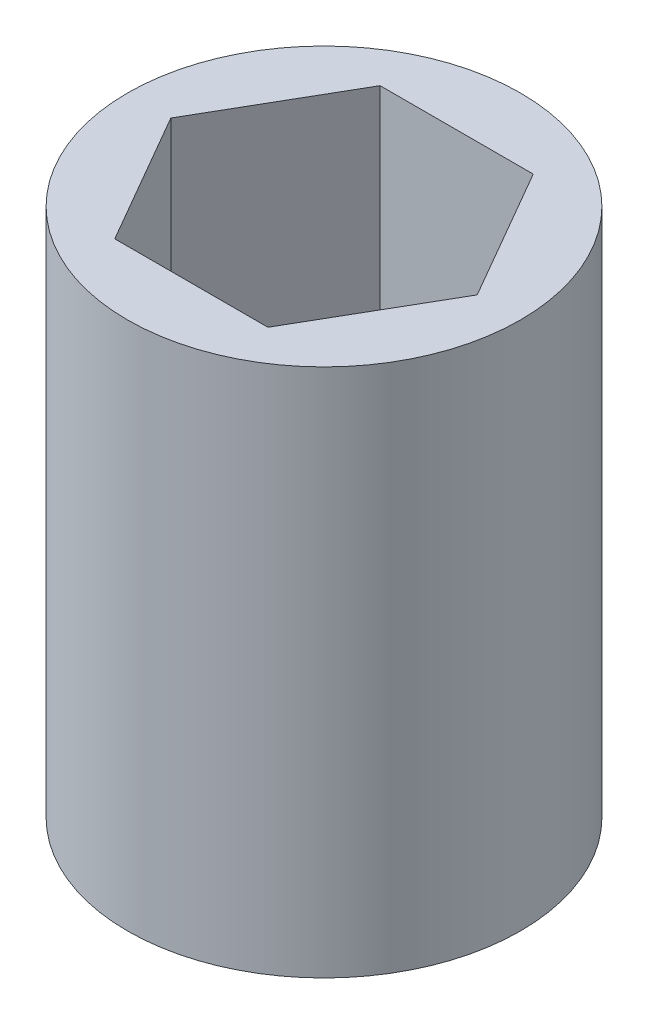
ISO-10303-21;
HEADER;
FILE_DESCRIPTION(('STEP AP214'),'2;1');
FILE_NAME('part.step','',(''),(''),'','','');
FILE_SCHEMA(('AUTOMOTIVE_DESIGN { 1 0 10303 214 1 1 1 1 }'));
ENDSEC;
DATA;
#1=APPLICATION_CONTEXT('core data for automotive mechanical design processes');
#2=APPLICATION_PROTOCOL_DEFINITION('international standard','automotive_design',2000,#1);
#3=PRODUCT_CONTEXT('',#1,'mechanical');
#4=PRODUCT('Part','Part','',(#3));
#5=PRODUCT_RELATED_PRODUCT_CATEGORY('part','',(#4));
#6=PRODUCT_DEFINITION_FORMATION('','',#4);
#7=PRODUCT_DEFINITION_CONTEXT('part definition',#1,'design');
#8=PRODUCT_DEFINITION('design','',#6,#7);
#9=PRODUCT_DEFINITION_SHAPE('','',#8);
#10=(LENGTH_UNIT() NAMED_UNIT(*) SI_UNIT(.MILLI.,.METRE.));
#11=(NAMED_UNIT(*) PLANE_ANGLE_UNIT() SI_UNIT($,.RADIAN.));
#12=(NAMED_UNIT(*) SI_UNIT($,.STERADIAN.) SOLID_ANGLE_UNIT());
#13=UNCERTAINTY_MEASURE_WITH_UNIT(LENGTH_MEASURE(1.E-05),#10,'distance_accuracy_value','');
#14=(GEOMETRIC_REPRESENTATION_CONTEXT(3) GLOBAL_UNCERTAINTY_ASSIGNED_CONTEXT((#13)) GLOBAL_UNIT_ASSIGNED_CONTEXT((#10,
#11,#12)) REPRESENTATION_CONTEXT('',''));
#15=CARTESIAN_POINT('',(0.,0.,0.));
#16=DIRECTION('',(0.,0.,1.));
#17=DIRECTION('',(1.,0.,0.));
#18=AXIS2_PLACEMENT_3D('',#15,#16,#17);
#19=CARTESIAN_POINT('',(0.,27.35834,0.));
#20=DIRECTION('',(0.,1.,0.));
#21=DIRECTION('',(0.,0.,1.));
#22=AXIS2_PLACEMENT_3D('',#19,#20,#21);
#23=PLANE('',#22);
#24=CARTESIAN_POINT('',(0.,27.35834,0.));
#25=DIRECTION('',(0.,1.,0.));
#26=DIRECTION('',(0.,0.,1.));
#27=AXIS2_PLACEMENT_3D('',#24,#25,#26);
#28=CIRCLE('',#27,10.16);
#29=CARTESIAN_POINT('',(0.,27.35834,10.16));
#30=VERTEX_POINT('',#29);
#31=EDGE_CURVE('E11',#30,#30,#28,.T.);
#32=ORIENTED_EDGE('',*,*,#31,.T.);
#33=EDGE_LOOP('',(#32));
#34=FACE_BOUND('',#33,.T.);
#35=DIRECTION('',(-0.5,0.,-0.866025403784438));
#36=VECTOR('',#35,1.);
#37=CARTESIAN_POINT('',(7.9189362922049,27.35834,0.));
#38=LINE('',#37,#36);
#39=CARTESIAN_POINT('',(7.9189362922049,27.35834,0.));
#40=VERTEX_POINT('',#39);
#41=CARTESIAN_POINT('',(3.95946814610245,27.35834,-6.858));
#42=VERTEX_POINT('',#41);
#43=EDGE_CURVE('E101',#40,#42,#38,.T.);
#44=ORIENTED_EDGE('',*,*,#43,.F.);
#45=DIRECTION('',(0.5,0.,-0.866025403784439));
#46=VECTOR('',#45,1.);
#47=CARTESIAN_POINT('',(3.95946814610245,27.35834,6.858));
#48=LINE('',#47,#46);
#49=CARTESIAN_POINT('',(3.95946814610245,27.35834,6.858));
#50=VERTEX_POINT('',#49);
#51=EDGE_CURVE('E93',#50,#40,#48,.T.);
#52=ORIENTED_EDGE('',*,*,#51,.F.);
#53=DIRECTION('',(1.,0.,0.));
#54=VECTOR('',#53,1.);
#55=CARTESIAN_POINT('',(-3.95946814610245,27.35834,6.858));
#56=LINE('',#55,#54);
#57=CARTESIAN_POINT('',(-3.95946814610245,27.35834,6.858));
#58=VERTEX_POINT('',#57);
#59=EDGE_CURVE('E121',#58,#50,#56,.T.);
#60=ORIENTED_EDGE('',*,*,#59,.F.);
#61=DIRECTION('',(0.5,0.,0.866025403784439));
#62=VECTOR('',#61,1.);
#63=CARTESIAN_POINT('',(-7.91893629220491,27.35834,0.));
#64=LINE('',#63,#62);
#65=CARTESIAN_POINT('',(-7.91893629220491,27.35834,0.));
#66=VERTEX_POINT('',#65);
#67=EDGE_CURVE('E119',#66,#58,#64,.T.);
#68=ORIENTED_EDGE('',*,*,#67,.F.);
#69=DIRECTION('',(-0.5,0.,0.866025403784439));
#70=VECTOR('',#69,1.);
#71=CARTESIAN_POINT('',(-3.95946814610245,27.35834,-6.858));
#72=LINE('',#71,#70);
#73=CARTESIAN_POINT('',(-3.95946814610245,27.35834,-6.858));
#74=VERTEX_POINT('',#73);
#75=EDGE_CURVE('E115',#74,#66,#72,.T.);
#76=ORIENTED_EDGE('',*,*,#75,.F.);
#77=DIRECTION('',(-1.,0.,0.));
#78=VECTOR('',#77,1.);
#79=CARTESIAN_POINT('',(3.95946814610245,27.35834,-6.858));
#80=LINE('',#79,#78);
#81=EDGE_CURVE('E113',#42,#74,#80,.T.);
#82=ORIENTED_EDGE('',*,*,#81,.F.);
#83=EDGE_LOOP('',(#44,#52,#60,#68,#76,#82));
#84=FACE_BOUND('',#83,.T.);
#85=ADVANCED_FACE('F37',(#34,#84),#23,.T.);
#86=CARTESIAN_POINT('',(0.,0.,0.));
#87=DIRECTION('',(0.,1.,0.));
#88=DIRECTION('',(0.,0.,1.));
#89=AXIS2_PLACEMENT_3D('',#86,#87,#88);
#90=PLANE('',#89);
#91=CARTESIAN_POINT('',(0.,0.,0.));
#92=DIRECTION('',(0.,1.,0.));
#93=DIRECTION('',(0.,0.,1.));
#94=AXIS2_PLACEMENT_3D('',#91,#92,#93);
#95=CIRCLE('',#94,10.16);
#96=CARTESIAN_POINT('',(0.,0.,10.16));
#97=VERTEX_POINT('',#96);
#98=EDGE_CURVE('E41',#97,#97,#95,.T.);
#99=ORIENTED_EDGE('',*,*,#98,.F.);
#100=EDGE_LOOP('',(#99));
#101=FACE_BOUND('',#100,.T.);
#102=DIRECTION('',(0.5,0.,-0.866025403784439));
#103=VECTOR('',#102,1.);
#104=CARTESIAN_POINT('',(3.95946814610245,0.,6.858));
#105=LINE('',#104,#103);
#106=CARTESIAN_POINT('',(3.95946814610245,0.,6.858));
#107=VERTEX_POINT('',#106);
#108=CARTESIAN_POINT('',(7.9189362922049,0.,0.));
#109=VERTEX_POINT('',#108);
#110=EDGE_CURVE('E62',#107,#109,#105,.T.);
#111=ORIENTED_EDGE('',*,*,#110,.T.);
#112=DIRECTION('',(-0.5,0.,-0.866025403784438));
#113=VECTOR('',#112,1.);
#114=CARTESIAN_POINT('',(7.9189362922049,0.,0.));
#115=LINE('',#114,#113);
#116=CARTESIAN_POINT('',(3.95946814610245,0.,-6.858));
#117=VERTEX_POINT('',#116);
#118=EDGE_CURVE('E108',#109,#117,#115,.T.);
#119=ORIENTED_EDGE('',*,*,#118,.T.);
#120=DIRECTION('',(-1.,0.,0.));
#121=VECTOR('',#120,1.);
#122=CARTESIAN_POINT('',(3.95946814610245,0.,-6.858));
#123=LINE('',#122,#121);
#124=CARTESIAN_POINT('',(-3.95946814610245,0.,-6.858));
#125=VERTEX_POINT('',#124);
#126=EDGE_CURVE('E126',#117,#125,#123,.T.);
#127=ORIENTED_EDGE('',*,*,#126,.T.);
#128=DIRECTION('',(-0.5,0.,0.866025403784439));
#129=VECTOR('',#128,1.);
#130=CARTESIAN_POINT('',(-3.95946814610245,0.,-6.858));
#131=LINE('',#130,#129);
#132=CARTESIAN_POINT('',(-7.91893629220491,0.,0.));
#133=VERTEX_POINT('',#132);
#134=EDGE_CURVE('E129',#125,#133,#131,.T.);
#135=ORIENTED_EDGE('',*,*,#134,.T.);
#136=DIRECTION('',(0.5,0.,0.866025403784439));
#137=VECTOR('',#136,1.);
#138=CARTESIAN_POINT('',(-7.91893629220491,0.,0.));
#139=LINE('',#138,#137);
#140=CARTESIAN_POINT('',(-3.95946814610245,0.,6.858));
#141=VERTEX_POINT('',#140);
#142=EDGE_CURVE('E133',#133,#141,#139,.T.);
#143=ORIENTED_EDGE('',*,*,#142,.T.);
#144=DIRECTION('',(1.,0.,0.));
#145=VECTOR('',#144,1.);
#146=CARTESIAN_POINT('',(-3.95946814610245,0.,6.858));
#147=LINE('',#146,#145);
#148=EDGE_CURVE('E102',#141,#107,#147,.T.);
#149=ORIENTED_EDGE('',*,*,#148,.T.);
#150=EDGE_LOOP('',(#111,#119,#127,#135,#143,#149));
#151=FACE_BOUND('',#150,.T.);
#152=ADVANCED_FACE('F155',(#101,#151),#90,.F.);
#153=CARTESIAN_POINT('',(0.,27.35834,0.));
#154=DIRECTION('',(0.,-1.,0.));
#155=DIRECTION('',(0.,0.,-1.));
#156=AXIS2_PLACEMENT_3D('',#153,#154,#155);
#157=CYLINDRICAL_SURFACE('',#156,10.16);
#158=ORIENTED_EDGE('',*,*,#31,.F.);
#159=EDGE_LOOP('',(#158));
#160=FACE_BOUND('',#159,.T.);
#161=ORIENTED_EDGE('',*,*,#98,.T.);
#162=EDGE_LOOP('',(#161));
#163=FACE_BOUND('',#162,.T.);
#164=ADVANCED_FACE('F39',(#160,#163),#157,.T.);
#165=CARTESIAN_POINT('',(3.95946814610245,27.35834,6.858));
#166=DIRECTION('',(-0.866025403784439,0.,-0.5));
#167=DIRECTION('',(-0.5,0.,0.866025403784439));
#168=AXIS2_PLACEMENT_3D('',#165,#166,#167);
#169=PLANE('',#168);
#170=ORIENTED_EDGE('',*,*,#110,.F.);
#171=DIRECTION('',(0.,-1.,0.));
#172=VECTOR('',#171,1.);
#173=CARTESIAN_POINT('',(3.95946814610245,27.35834,6.858));
#174=LINE('',#173,#172);
#175=EDGE_CURVE('E97',#50,#107,#174,.T.);
#176=ORIENTED_EDGE('',*,*,#175,.F.);
#177=ORIENTED_EDGE('',*,*,#51,.T.);
#178=DIRECTION('',(0.,-1.,0.));
#179=VECTOR('',#178,1.);
#180=CARTESIAN_POINT('',(7.9189362922049,27.35834,0.));
#181=LINE('',#180,#179);
#182=EDGE_CURVE('E96',#40,#109,#181,.T.);
#183=ORIENTED_EDGE('',*,*,#182,.T.);
#184=EDGE_LOOP('',(#170,#176,#177,#183));
#185=FACE_BOUND('',#184,.T.);
#186=ADVANCED_FACE('F95',(#185),#169,.T.);
#187=CARTESIAN_POINT('',(7.9189362922049,27.35834,0.));
#188=DIRECTION('',(-0.866025403784439,0.,0.5));
#189=DIRECTION('',(0.5,0.,0.866025403784439));
#190=AXIS2_PLACEMENT_3D('',#187,#188,#189);
#191=PLANE('',#190);
#192=ORIENTED_EDGE('',*,*,#118,.F.);
#193=ORIENTED_EDGE('',*,*,#182,.F.);
#194=ORIENTED_EDGE('',*,*,#43,.T.);
#195=DIRECTION('',(0.,-1.,0.));
#196=VECTOR('',#195,1.);
#197=CARTESIAN_POINT('',(3.95946814610245,27.35834,-6.858));
#198=LINE('',#197,#196);
#199=EDGE_CURVE('E109',#42,#117,#198,.T.);
#200=ORIENTED_EDGE('',*,*,#199,.T.);
#201=EDGE_LOOP('',(#192,#193,#194,#200));
#202=FACE_BOUND('',#201,.T.);
#203=ADVANCED_FACE('F105',(#202),#191,.T.);
#204=CARTESIAN_POINT('',(3.95946814610245,27.35834,-6.858));
#205=DIRECTION('',(0.,0.,1.));
#206=DIRECTION('',(1.,0.,0.));
#207=AXIS2_PLACEMENT_3D('',#204,#205,#206);
#208=PLANE('',#207);
#209=ORIENTED_EDGE('',*,*,#126,.F.);
#210=ORIENTED_EDGE('',*,*,#199,.F.);
#211=ORIENTED_EDGE('',*,*,#81,.T.);
#212=DIRECTION('',(0.,-1.,0.));
#213=VECTOR('',#212,1.);
#214=CARTESIAN_POINT('',(-3.95946814610245,27.35834,-6.858));
#215=LINE('',#214,#213);
#216=EDGE_CURVE('E147',#74,#125,#215,.T.);
#217=ORIENTED_EDGE('',*,*,#216,.T.);
#218=EDGE_LOOP('',(#209,#210,#211,#217));
#219=FACE_BOUND('',#218,.T.);
#220=ADVANCED_FACE('F151',(#219),#208,.T.);
#221=CARTESIAN_POINT('',(-3.95946814610245,27.35834,-6.858));
#222=DIRECTION('',(0.866025403784439,0.,0.5));
#223=DIRECTION('',(0.5,0.,-0.866025403784439));
#224=AXIS2_PLACEMENT_3D('',#221,#222,#223);
#225=PLANE('',#224);
#226=ORIENTED_EDGE('',*,*,#134,.F.);
#227=ORIENTED_EDGE('',*,*,#216,.F.);
#228=ORIENTED_EDGE('',*,*,#75,.T.);
#229=DIRECTION('',(0.,-1.,0.));
#230=VECTOR('',#229,1.);
#231=CARTESIAN_POINT('',(-7.91893629220491,27.35834,0.));
#232=LINE('',#231,#230);
#233=EDGE_CURVE('E144',#66,#133,#232,.T.);
#234=ORIENTED_EDGE('',*,*,#233,.T.);
#235=EDGE_LOOP('',(#226,#227,#228,#234));
#236=FACE_BOUND('',#235,.T.);
#237=ADVANCED_FACE('F163',(#236),#225,.T.);
#238=CARTESIAN_POINT('',(-7.91893629220491,27.35834,0.));
#239=DIRECTION('',(0.866025403784438,0.,-0.5));
#240=DIRECTION('',(-0.5,0.,-0.866025403784439));
#241=AXIS2_PLACEMENT_3D('',#238,#239,#240);
#242=PLANE('',#241);
#243=ORIENTED_EDGE('',*,*,#142,.F.);
#244=ORIENTED_EDGE('',*,*,#233,.F.);
#245=ORIENTED_EDGE('',*,*,#67,.T.);
#246=DIRECTION('',(0.,-1.,0.));
#247=VECTOR('',#246,1.);
#248=CARTESIAN_POINT('',(-3.95946814610245,27.35834,6.858));
#249=LINE('',#248,#247);
#250=EDGE_CURVE('E52',#58,#141,#249,.T.);
#251=ORIENTED_EDGE('',*,*,#250,.T.);
#252=EDGE_LOOP('',(#243,#244,#245,#251));
#253=FACE_BOUND('',#252,.T.);
#254=ADVANCED_FACE('F161',(#253),#242,.T.);
#255=CARTESIAN_POINT('',(-3.95946814610245,27.35834,6.858));
#256=DIRECTION('',(0.,0.,-1.));
#257=DIRECTION('',(-1.,0.,0.));
#258=AXIS2_PLACEMENT_3D('',#255,#256,#257);
#259=PLANE('',#258);
#260=ORIENTED_EDGE('',*,*,#148,.F.);
#261=ORIENTED_EDGE('',*,*,#250,.F.);
#262=ORIENTED_EDGE('',*,*,#59,.T.);
#263=ORIENTED_EDGE('',*,*,#175,.T.);
#264=EDGE_LOOP('',(#260,#261,#262,#263));
#265=FACE_BOUND('',#264,.T.);
#266=ADVANCED_FACE('F157',(#265),#259,.T.);
#267=CLOSED_SHELL('',(#85,#152,#164,#186,#203,#220,#237,#254,#266));
#268=MANIFOLD_SOLID_BREP('B2',#267);
#269=ADVANCED_BREP_SHAPE_REPRESENTATION('',(#18,#268),#14);
#270=SHAPE_DEFINITION_REPRESENTATION(#9,#269);
ENDSEC;
END-ISO-10303-21;
